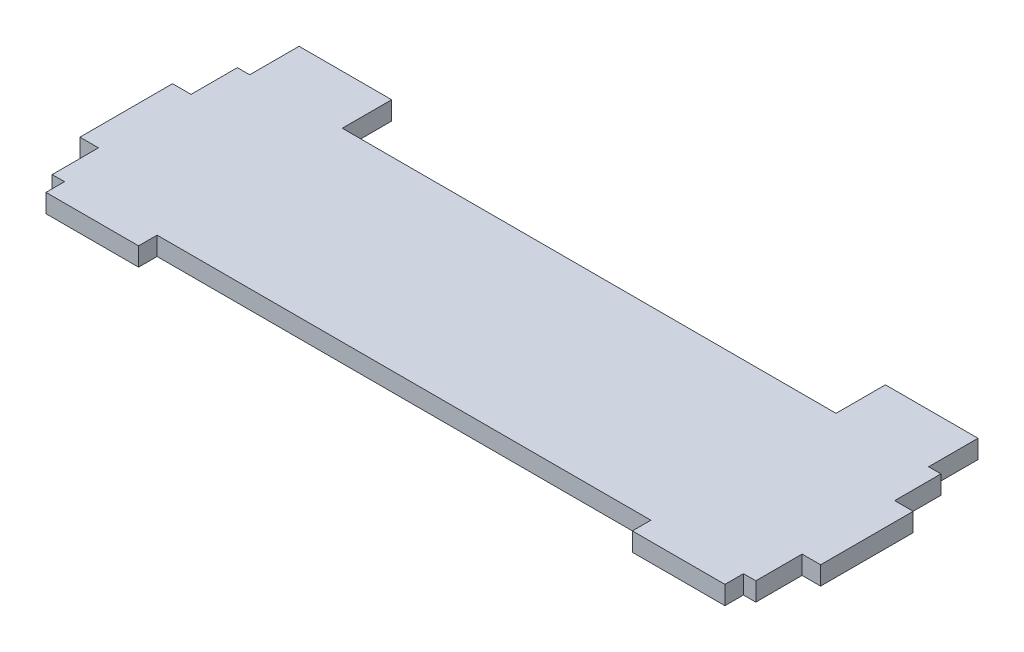
ISO-10303-21;
HEADER;
FILE_DESCRIPTION(('STEP AP214'),'2;1');
FILE_NAME('part.step','',(''),(''),'','','');
FILE_SCHEMA(('AUTOMOTIVE_DESIGN { 1 0 10303 214 1 1 1 1 }'));
ENDSEC;
DATA;
#1=APPLICATION_CONTEXT('core data for automotive mechanical design processes');
#2=APPLICATION_PROTOCOL_DEFINITION('international standard','automotive_design',2000,#1);
#3=PRODUCT_CONTEXT('',#1,'mechanical');
#4=PRODUCT('Part','Part','',(#3));
#5=PRODUCT_RELATED_PRODUCT_CATEGORY('part','',(#4));
#6=PRODUCT_DEFINITION_FORMATION('','',#4);
#7=PRODUCT_DEFINITION_CONTEXT('part definition',#1,'design');
#8=PRODUCT_DEFINITION('design','',#6,#7);
#9=PRODUCT_DEFINITION_SHAPE('','',#8);
#10=(LENGTH_UNIT() NAMED_UNIT(*) SI_UNIT(.MILLI.,.METRE.));
#11=(NAMED_UNIT(*) PLANE_ANGLE_UNIT() SI_UNIT($,.RADIAN.));
#12=(NAMED_UNIT(*) SI_UNIT($,.STERADIAN.) SOLID_ANGLE_UNIT());
#13=UNCERTAINTY_MEASURE_WITH_UNIT(LENGTH_MEASURE(1.E-05),#10,'distance_accuracy_value','');
#14=(GEOMETRIC_REPRESENTATION_CONTEXT(3) GLOBAL_UNCERTAINTY_ASSIGNED_CONTEXT((#13)) GLOBAL_UNIT_ASSIGNED_CONTEXT((#10,
#11,#12)) REPRESENTATION_CONTEXT('',''));
#15=CARTESIAN_POINT('',(0.,0.,0.));
#16=DIRECTION('',(0.,0.,1.));
#17=DIRECTION('',(1.,0.,0.));
#18=AXIS2_PLACEMENT_3D('',#15,#16,#17);
#19=CARTESIAN_POINT('',(57.,3.,-7.49999999999875));
#20=DIRECTION('',(0.,0.,1.));
#21=DIRECTION('',(1.,0.,0.));
#22=AXIS2_PLACEMENT_3D('',#19,#20,#21);
#23=PLANE('',#22);
#24=DIRECTION('',(-1.,0.,0.));
#25=VECTOR('',#24,1.);
#26=CARTESIAN_POINT('',(57.,0.,-7.49999999999875));
#27=LINE('',#26,#25);
#28=CARTESIAN_POINT('',(60.,0.,-7.49999999999875));
#29=VERTEX_POINT('',#28);
#30=CARTESIAN_POINT('',(57.,0.,-7.49999999999875));
#31=VERTEX_POINT('',#30);
#32=EDGE_CURVE('E248',#29,#31,#27,.T.);
#33=ORIENTED_EDGE('',*,*,#32,.T.);
#34=DIRECTION('',(0.,-1.,0.));
#35=VECTOR('',#34,1.);
#36=CARTESIAN_POINT('',(57.,3.,-7.49999999999875));
#37=LINE('',#36,#35);
#38=CARTESIAN_POINT('',(57.,3.,-7.49999999999875));
#39=VERTEX_POINT('',#38);
#40=EDGE_CURVE('E11',#39,#31,#37,.T.);
#41=ORIENTED_EDGE('',*,*,#40,.F.);
#42=DIRECTION('',(-1.,0.,0.));
#43=VECTOR('',#42,1.);
#44=CARTESIAN_POINT('',(57.,3.,-7.49999999999875));
#45=LINE('',#44,#43);
#46=CARTESIAN_POINT('',(60.,3.,-7.49999999999875));
#47=VERTEX_POINT('',#46);
#48=EDGE_CURVE('E302',#47,#39,#45,.T.);
#49=ORIENTED_EDGE('',*,*,#48,.F.);
#50=DIRECTION('',(0.,-1.,0.));
#51=VECTOR('',#50,1.);
#52=CARTESIAN_POINT('',(60.,3.,-7.49999999999875));
#53=LINE('',#52,#51);
#54=EDGE_CURVE('E244',#47,#29,#53,.T.);
#55=ORIENTED_EDGE('',*,*,#54,.T.);
#56=EDGE_LOOP('',(#33,#41,#49,#55));
#57=FACE_BOUND('',#56,.T.);
#58=ADVANCED_FACE('F32',(#57),#23,.F.);
#59=CARTESIAN_POINT('',(57.,3.,-15.));
#60=DIRECTION('',(-1.,0.,0.));
#61=DIRECTION('',(0.,0.,1.));
#62=AXIS2_PLACEMENT_3D('',#59,#60,#61);
#63=PLANE('',#62);
#64=DIRECTION('',(0.,0.,-1.));
#65=VECTOR('',#64,1.);
#66=CARTESIAN_POINT('',(57.,0.,-15.));
#67=LINE('',#66,#65);
#68=CARTESIAN_POINT('',(57.,0.,-15.));
#69=VERTEX_POINT('',#68);
#70=EDGE_CURVE('E251',#31,#69,#67,.T.);
#71=ORIENTED_EDGE('',*,*,#70,.T.);
#72=DIRECTION('',(0.,-1.,0.));
#73=VECTOR('',#72,1.);
#74=CARTESIAN_POINT('',(57.,3.,-15.));
#75=LINE('',#74,#73);
#76=CARTESIAN_POINT('',(57.,3.,-15.));
#77=VERTEX_POINT('',#76);
#78=EDGE_CURVE('E40',#77,#69,#75,.T.);
#79=ORIENTED_EDGE('',*,*,#78,.F.);
#80=DIRECTION('',(0.,0.,-1.));
#81=VECTOR('',#80,1.);
#82=CARTESIAN_POINT('',(57.,3.,-15.));
#83=LINE('',#82,#81);
#84=EDGE_CURVE('E151',#39,#77,#83,.T.);
#85=ORIENTED_EDGE('',*,*,#84,.F.);
#86=ORIENTED_EDGE('',*,*,#40,.T.);
#87=EDGE_LOOP('',(#71,#79,#85,#86));
#88=FACE_BOUND('',#87,.T.);
#89=ADVANCED_FACE('F460',(#88),#63,.F.);
#90=CARTESIAN_POINT('',(55.,3.,-15.));
#91=DIRECTION('',(0.,0.,1.));
#92=DIRECTION('',(1.,0.,0.));
#93=AXIS2_PLACEMENT_3D('',#90,#91,#92);
#94=PLANE('',#93);
#95=DIRECTION('',(-1.,0.,0.));
#96=VECTOR('',#95,1.);
#97=CARTESIAN_POINT('',(55.,0.,-15.));
#98=LINE('',#97,#96);
#99=CARTESIAN_POINT('',(55.,0.,-15.));
#100=VERTEX_POINT('',#99);
#101=EDGE_CURVE('E253',#69,#100,#98,.T.);
#102=ORIENTED_EDGE('',*,*,#101,.T.);
#103=DIRECTION('',(0.,-1.,0.));
#104=VECTOR('',#103,1.);
#105=CARTESIAN_POINT('',(55.,3.,-15.));
#106=LINE('',#105,#104);
#107=CARTESIAN_POINT('',(55.,3.,-15.));
#108=VERTEX_POINT('',#107);
#109=EDGE_CURVE('E369',#108,#100,#106,.T.);
#110=ORIENTED_EDGE('',*,*,#109,.F.);
#111=DIRECTION('',(-1.,0.,0.));
#112=VECTOR('',#111,1.);
#113=CARTESIAN_POINT('',(55.,3.,-15.));
#114=LINE('',#113,#112);
#115=EDGE_CURVE('E377',#77,#108,#114,.T.);
#116=ORIENTED_EDGE('',*,*,#115,.F.);
#117=ORIENTED_EDGE('',*,*,#78,.T.);
#118=EDGE_LOOP('',(#102,#110,#116,#117));
#119=FACE_BOUND('',#118,.T.);
#120=ADVANCED_FACE('F375',(#119),#94,.F.);
#121=CARTESIAN_POINT('',(55.,3.,-23.));
#122=DIRECTION('',(-1.,0.,0.));
#123=DIRECTION('',(0.,0.,1.));
#124=AXIS2_PLACEMENT_3D('',#121,#122,#123);
#125=PLANE('',#124);
#126=DIRECTION('',(0.,0.,-1.));
#127=VECTOR('',#126,1.);
#128=CARTESIAN_POINT('',(55.,0.,-23.));
#129=LINE('',#128,#127);
#130=CARTESIAN_POINT('',(55.,0.,-23.));
#131=VERTEX_POINT('',#130);
#132=EDGE_CURVE('E255',#100,#131,#129,.T.);
#133=ORIENTED_EDGE('',*,*,#132,.T.);
#134=DIRECTION('',(0.,-1.,0.));
#135=VECTOR('',#134,1.);
#136=CARTESIAN_POINT('',(55.,3.,-23.));
#137=LINE('',#136,#135);
#138=CARTESIAN_POINT('',(55.,3.,-23.));
#139=VERTEX_POINT('',#138);
#140=EDGE_CURVE('E366',#139,#131,#137,.T.);
#141=ORIENTED_EDGE('',*,*,#140,.F.);
#142=DIRECTION('',(0.,0.,-1.));
#143=VECTOR('',#142,1.);
#144=CARTESIAN_POINT('',(55.,3.,-23.));
#145=LINE('',#144,#143);
#146=EDGE_CURVE('E395',#108,#139,#145,.T.);
#147=ORIENTED_EDGE('',*,*,#146,.F.);
#148=ORIENTED_EDGE('',*,*,#109,.T.);
#149=EDGE_LOOP('',(#133,#141,#147,#148));
#150=FACE_BOUND('',#149,.T.);
#151=ADVANCED_FACE('F386',(#150),#125,.F.);
#152=CARTESIAN_POINT('',(40.,3.,-23.));
#153=DIRECTION('',(0.,0.,1.));
#154=DIRECTION('',(1.,0.,0.));
#155=AXIS2_PLACEMENT_3D('',#152,#153,#154);
#156=PLANE('',#155);
#157=DIRECTION('',(-1.,0.,0.));
#158=VECTOR('',#157,1.);
#159=CARTESIAN_POINT('',(40.,0.,-23.));
#160=LINE('',#159,#158);
#161=CARTESIAN_POINT('',(40.,0.,-23.));
#162=VERTEX_POINT('',#161);
#163=EDGE_CURVE('E257',#131,#162,#160,.T.);
#164=ORIENTED_EDGE('',*,*,#163,.T.);
#165=DIRECTION('',(0.,-1.,0.));
#166=VECTOR('',#165,1.);
#167=CARTESIAN_POINT('',(40.,3.,-23.));
#168=LINE('',#167,#166);
#169=CARTESIAN_POINT('',(40.,3.,-23.));
#170=VERTEX_POINT('',#169);
#171=EDGE_CURVE('E363',#170,#162,#168,.T.);
#172=ORIENTED_EDGE('',*,*,#171,.F.);
#173=DIRECTION('',(-1.,0.,0.));
#174=VECTOR('',#173,1.);
#175=CARTESIAN_POINT('',(40.,3.,-23.));
#176=LINE('',#175,#174);
#177=EDGE_CURVE('E392',#139,#170,#176,.T.);
#178=ORIENTED_EDGE('',*,*,#177,.F.);
#179=ORIENTED_EDGE('',*,*,#140,.T.);
#180=EDGE_LOOP('',(#164,#172,#178,#179));
#181=FACE_BOUND('',#180,.T.);
#182=ADVANCED_FACE('F390',(#181),#156,.F.);
#183=CARTESIAN_POINT('',(40.,3.,-15.));
#184=DIRECTION('',(1.,0.,0.));
#185=DIRECTION('',(0.,0.,-1.));
#186=AXIS2_PLACEMENT_3D('',#183,#184,#185);
#187=PLANE('',#186);
#188=DIRECTION('',(0.,0.,1.));
#189=VECTOR('',#188,1.);
#190=CARTESIAN_POINT('',(40.,0.,-15.));
#191=LINE('',#190,#189);
#192=CARTESIAN_POINT('',(40.,0.,-15.));
#193=VERTEX_POINT('',#192);
#194=EDGE_CURVE('E259',#162,#193,#191,.T.);
#195=ORIENTED_EDGE('',*,*,#194,.T.);
#196=DIRECTION('',(0.,-1.,0.));
#197=VECTOR('',#196,1.);
#198=CARTESIAN_POINT('',(40.,3.,-15.));
#199=LINE('',#198,#197);
#200=CARTESIAN_POINT('',(40.,3.,-15.));
#201=VERTEX_POINT('',#200);
#202=EDGE_CURVE('E360',#201,#193,#199,.T.);
#203=ORIENTED_EDGE('',*,*,#202,.F.);
#204=DIRECTION('',(0.,0.,1.));
#205=VECTOR('',#204,1.);
#206=CARTESIAN_POINT('',(40.,3.,-15.));
#207=LINE('',#206,#205);
#208=EDGE_CURVE('E394',#170,#201,#207,.T.);
#209=ORIENTED_EDGE('',*,*,#208,.F.);
#210=ORIENTED_EDGE('',*,*,#171,.T.);
#211=EDGE_LOOP('',(#195,#203,#209,#210));
#212=FACE_BOUND('',#211,.T.);
#213=ADVANCED_FACE('F473',(#212),#187,.F.);
#214=CARTESIAN_POINT('',(-40.,3.,-15.));
#215=DIRECTION('',(0.,0.,1.));
#216=DIRECTION('',(1.,0.,0.));
#217=AXIS2_PLACEMENT_3D('',#214,#215,#216);
#218=PLANE('',#217);
#219=DIRECTION('',(-1.,0.,0.));
#220=VECTOR('',#219,1.);
#221=CARTESIAN_POINT('',(-40.,0.,-15.));
#222=LINE('',#221,#220);
#223=CARTESIAN_POINT('',(-40.,0.,-15.));
#224=VERTEX_POINT('',#223);
#225=EDGE_CURVE('E261',#193,#224,#222,.T.);
#226=ORIENTED_EDGE('',*,*,#225,.T.);
#227=DIRECTION('',(0.,-1.,0.));
#228=VECTOR('',#227,1.);
#229=CARTESIAN_POINT('',(-40.,3.,-15.));
#230=LINE('',#229,#228);
#231=CARTESIAN_POINT('',(-40.,3.,-15.));
#232=VERTEX_POINT('',#231);
#233=EDGE_CURVE('E357',#232,#224,#230,.T.);
#234=ORIENTED_EDGE('',*,*,#233,.F.);
#235=DIRECTION('',(-1.,0.,0.));
#236=VECTOR('',#235,1.);
#237=CARTESIAN_POINT('',(-40.,3.,-15.));
#238=LINE('',#237,#236);
#239=EDGE_CURVE('E397',#201,#232,#238,.T.);
#240=ORIENTED_EDGE('',*,*,#239,.F.);
#241=ORIENTED_EDGE('',*,*,#202,.T.);
#242=EDGE_LOOP('',(#226,#234,#240,#241));
#243=FACE_BOUND('',#242,.T.);
#244=ADVANCED_FACE('F476',(#243),#218,.F.);
#245=CARTESIAN_POINT('',(-40.,3.,-23.));
#246=DIRECTION('',(-1.,0.,0.));
#247=DIRECTION('',(0.,0.,1.));
#248=AXIS2_PLACEMENT_3D('',#245,#246,#247);
#249=PLANE('',#248);
#250=DIRECTION('',(0.,0.,-1.));
#251=VECTOR('',#250,1.);
#252=CARTESIAN_POINT('',(-40.,0.,-23.));
#253=LINE('',#252,#251);
#254=CARTESIAN_POINT('',(-40.,0.,-23.));
#255=VERTEX_POINT('',#254);
#256=EDGE_CURVE('E263',#224,#255,#253,.T.);
#257=ORIENTED_EDGE('',*,*,#256,.T.);
#258=DIRECTION('',(0.,-1.,0.));
#259=VECTOR('',#258,1.);
#260=CARTESIAN_POINT('',(-40.,3.,-23.));
#261=LINE('',#260,#259);
#262=CARTESIAN_POINT('',(-40.,3.,-23.));
#263=VERTEX_POINT('',#262);
#264=EDGE_CURVE('E354',#263,#255,#261,.T.);
#265=ORIENTED_EDGE('',*,*,#264,.F.);
#266=DIRECTION('',(0.,0.,-1.));
#267=VECTOR('',#266,1.);
#268=CARTESIAN_POINT('',(-40.,3.,-23.));
#269=LINE('',#268,#267);
#270=EDGE_CURVE('E403',#232,#263,#269,.T.);
#271=ORIENTED_EDGE('',*,*,#270,.F.);
#272=ORIENTED_EDGE('',*,*,#233,.T.);
#273=EDGE_LOOP('',(#257,#265,#271,#272));
#274=FACE_BOUND('',#273,.T.);
#275=ADVANCED_FACE('F480',(#274),#249,.F.);
#276=CARTESIAN_POINT('',(-55.,3.,-23.));
#277=DIRECTION('',(0.,0.,1.));
#278=DIRECTION('',(1.,0.,0.));
#279=AXIS2_PLACEMENT_3D('',#276,#277,#278);
#280=PLANE('',#279);
#281=DIRECTION('',(-1.,0.,0.));
#282=VECTOR('',#281,1.);
#283=CARTESIAN_POINT('',(-55.,0.,-23.));
#284=LINE('',#283,#282);
#285=CARTESIAN_POINT('',(-55.,0.,-23.));
#286=VERTEX_POINT('',#285);
#287=EDGE_CURVE('E265',#255,#286,#284,.T.);
#288=ORIENTED_EDGE('',*,*,#287,.T.);
#289=DIRECTION('',(0.,-1.,0.));
#290=VECTOR('',#289,1.);
#291=CARTESIAN_POINT('',(-55.,3.,-23.));
#292=LINE('',#291,#290);
#293=CARTESIAN_POINT('',(-55.,3.,-23.));
#294=VERTEX_POINT('',#293);
#295=EDGE_CURVE('E351',#294,#286,#292,.T.);
#296=ORIENTED_EDGE('',*,*,#295,.F.);
#297=DIRECTION('',(-1.,0.,0.));
#298=VECTOR('',#297,1.);
#299=CARTESIAN_POINT('',(-55.,3.,-23.));
#300=LINE('',#299,#298);
#301=EDGE_CURVE('E405',#263,#294,#300,.T.);
#302=ORIENTED_EDGE('',*,*,#301,.F.);
#303=ORIENTED_EDGE('',*,*,#264,.T.);
#304=EDGE_LOOP('',(#288,#296,#302,#303));
#305=FACE_BOUND('',#304,.T.);
#306=ADVANCED_FACE('F484',(#305),#280,.F.);
#307=CARTESIAN_POINT('',(-55.,3.,-15.));
#308=DIRECTION('',(1.,0.,0.));
#309=DIRECTION('',(0.,0.,-1.));
#310=AXIS2_PLACEMENT_3D('',#307,#308,#309);
#311=PLANE('',#310);
#312=DIRECTION('',(0.,0.,1.));
#313=VECTOR('',#312,1.);
#314=CARTESIAN_POINT('',(-55.,0.,-15.));
#315=LINE('',#314,#313);
#316=CARTESIAN_POINT('',(-55.,0.,-15.));
#317=VERTEX_POINT('',#316);
#318=EDGE_CURVE('E267',#286,#317,#315,.T.);
#319=ORIENTED_EDGE('',*,*,#318,.T.);
#320=DIRECTION('',(0.,-1.,0.));
#321=VECTOR('',#320,1.);
#322=CARTESIAN_POINT('',(-55.,3.,-15.));
#323=LINE('',#322,#321);
#324=CARTESIAN_POINT('',(-55.,3.,-15.));
#325=VERTEX_POINT('',#324);
#326=EDGE_CURVE('E348',#325,#317,#323,.T.);
#327=ORIENTED_EDGE('',*,*,#326,.F.);
#328=DIRECTION('',(0.,0.,1.));
#329=VECTOR('',#328,1.);
#330=CARTESIAN_POINT('',(-55.,3.,-15.));
#331=LINE('',#330,#329);
#332=EDGE_CURVE('E407',#294,#325,#331,.T.);
#333=ORIENTED_EDGE('',*,*,#332,.F.);
#334=ORIENTED_EDGE('',*,*,#295,.T.);
#335=EDGE_LOOP('',(#319,#327,#333,#334));
#336=FACE_BOUND('',#335,.T.);
#337=ADVANCED_FACE('F488',(#336),#311,.F.);
#338=CARTESIAN_POINT('',(-57.,3.,-15.));
#339=DIRECTION('',(0.,0.,1.));
#340=DIRECTION('',(1.,0.,0.));
#341=AXIS2_PLACEMENT_3D('',#338,#339,#340);
#342=PLANE('',#341);
#343=DIRECTION('',(-1.,0.,0.));
#344=VECTOR('',#343,1.);
#345=CARTESIAN_POINT('',(-57.,0.,-15.));
#346=LINE('',#345,#344);
#347=CARTESIAN_POINT('',(-57.,0.,-15.));
#348=VERTEX_POINT('',#347);
#349=EDGE_CURVE('E269',#317,#348,#346,.T.);
#350=ORIENTED_EDGE('',*,*,#349,.T.);
#351=DIRECTION('',(0.,-1.,0.));
#352=VECTOR('',#351,1.);
#353=CARTESIAN_POINT('',(-57.,3.,-15.));
#354=LINE('',#353,#352);
#355=CARTESIAN_POINT('',(-57.,3.,-15.));
#356=VERTEX_POINT('',#355);
#357=EDGE_CURVE('E345',#356,#348,#354,.T.);
#358=ORIENTED_EDGE('',*,*,#357,.F.);
#359=DIRECTION('',(-1.,0.,0.));
#360=VECTOR('',#359,1.);
#361=CARTESIAN_POINT('',(-57.,3.,-15.));
#362=LINE('',#361,#360);
#363=EDGE_CURVE('E409',#325,#356,#362,.T.);
#364=ORIENTED_EDGE('',*,*,#363,.F.);
#365=ORIENTED_EDGE('',*,*,#326,.T.);
#366=EDGE_LOOP('',(#350,#358,#364,#365));
#367=FACE_BOUND('',#366,.T.);
#368=ADVANCED_FACE('F492',(#367),#342,.F.);
#369=CARTESIAN_POINT('',(-57.,3.,-7.5));
#370=DIRECTION('',(1.,0.,0.));
#371=DIRECTION('',(0.,0.,-1.));
#372=AXIS2_PLACEMENT_3D('',#369,#370,#371);
#373=PLANE('',#372);
#374=DIRECTION('',(0.,0.,1.));
#375=VECTOR('',#374,1.);
#376=CARTESIAN_POINT('',(-57.,0.,-7.5));
#377=LINE('',#376,#375);
#378=CARTESIAN_POINT('',(-57.,0.,-7.5));
#379=VERTEX_POINT('',#378);
#380=EDGE_CURVE('E271',#348,#379,#377,.T.);
#381=ORIENTED_EDGE('',*,*,#380,.T.);
#382=DIRECTION('',(0.,-1.,0.));
#383=VECTOR('',#382,1.);
#384=CARTESIAN_POINT('',(-57.,3.,-7.5));
#385=LINE('',#384,#383);
#386=CARTESIAN_POINT('',(-57.,3.,-7.5));
#387=VERTEX_POINT('',#386);
#388=EDGE_CURVE('E342',#387,#379,#385,.T.);
#389=ORIENTED_EDGE('',*,*,#388,.F.);
#390=DIRECTION('',(0.,0.,1.));
#391=VECTOR('',#390,1.);
#392=CARTESIAN_POINT('',(-57.,3.,-7.5));
#393=LINE('',#392,#391);
#394=EDGE_CURVE('E411',#356,#387,#393,.T.);
#395=ORIENTED_EDGE('',*,*,#394,.F.);
#396=ORIENTED_EDGE('',*,*,#357,.T.);
#397=EDGE_LOOP('',(#381,#389,#395,#396));
#398=FACE_BOUND('',#397,.T.);
#399=ADVANCED_FACE('F496',(#398),#373,.F.);
#400=CARTESIAN_POINT('',(-60.,3.,-7.5));
#401=DIRECTION('',(0.,0.,1.));
#402=DIRECTION('',(1.,0.,0.));
#403=AXIS2_PLACEMENT_3D('',#400,#401,#402);
#404=PLANE('',#403);
#405=DIRECTION('',(-1.,0.,0.));
#406=VECTOR('',#405,1.);
#407=CARTESIAN_POINT('',(-60.,0.,-7.5));
#408=LINE('',#407,#406);
#409=CARTESIAN_POINT('',(-60.,0.,-7.5));
#410=VERTEX_POINT('',#409);
#411=EDGE_CURVE('E273',#379,#410,#408,.T.);
#412=ORIENTED_EDGE('',*,*,#411,.T.);
#413=DIRECTION('',(0.,-1.,0.));
#414=VECTOR('',#413,1.);
#415=CARTESIAN_POINT('',(-60.,3.,-7.5));
#416=LINE('',#415,#414);
#417=CARTESIAN_POINT('',(-60.,3.,-7.5));
#418=VERTEX_POINT('',#417);
#419=EDGE_CURVE('E339',#418,#410,#416,.T.);
#420=ORIENTED_EDGE('',*,*,#419,.F.);
#421=DIRECTION('',(-1.,0.,0.));
#422=VECTOR('',#421,1.);
#423=CARTESIAN_POINT('',(-60.,3.,-7.5));
#424=LINE('',#423,#422);
#425=EDGE_CURVE('E413',#387,#418,#424,.T.);
#426=ORIENTED_EDGE('',*,*,#425,.F.);
#427=ORIENTED_EDGE('',*,*,#388,.T.);
#428=EDGE_LOOP('',(#412,#420,#426,#427));
#429=FACE_BOUND('',#428,.T.);
#430=ADVANCED_FACE('F500',(#429),#404,.F.);
#431=CARTESIAN_POINT('',(-60.,3.,7.5));
#432=DIRECTION('',(1.,0.,0.));
#433=DIRECTION('',(0.,0.,-1.));
#434=AXIS2_PLACEMENT_3D('',#431,#432,#433);
#435=PLANE('',#434);
#436=DIRECTION('',(0.,0.,1.));
#437=VECTOR('',#436,1.);
#438=CARTESIAN_POINT('',(-60.,0.,7.5));
#439=LINE('',#438,#437);
#440=CARTESIAN_POINT('',(-60.,0.,7.5));
#441=VERTEX_POINT('',#440);
#442=EDGE_CURVE('E275',#410,#441,#439,.T.);
#443=ORIENTED_EDGE('',*,*,#442,.T.);
#444=DIRECTION('',(0.,-1.,0.));
#445=VECTOR('',#444,1.);
#446=CARTESIAN_POINT('',(-60.,3.,7.5));
#447=LINE('',#446,#445);
#448=CARTESIAN_POINT('',(-60.,3.,7.5));
#449=VERTEX_POINT('',#448);
#450=EDGE_CURVE('E336',#449,#441,#447,.T.);
#451=ORIENTED_EDGE('',*,*,#450,.F.);
#452=DIRECTION('',(0.,0.,1.));
#453=VECTOR('',#452,1.);
#454=CARTESIAN_POINT('',(-60.,3.,7.5));
#455=LINE('',#454,#453);
#456=EDGE_CURVE('E415',#418,#449,#455,.T.);
#457=ORIENTED_EDGE('',*,*,#456,.F.);
#458=ORIENTED_EDGE('',*,*,#419,.T.);
#459=EDGE_LOOP('',(#443,#451,#457,#458));
#460=FACE_BOUND('',#459,.T.);
#461=ADVANCED_FACE('F504',(#460),#435,.F.);
#462=CARTESIAN_POINT('',(-57.,3.,7.5));
#463=DIRECTION('',(0.,0.,-1.));
#464=DIRECTION('',(-1.,0.,0.));
#465=AXIS2_PLACEMENT_3D('',#462,#463,#464);
#466=PLANE('',#465);
#467=DIRECTION('',(1.,0.,0.));
#468=VECTOR('',#467,1.);
#469=CARTESIAN_POINT('',(-57.,0.,7.5));
#470=LINE('',#469,#468);
#471=CARTESIAN_POINT('',(-57.,0.,7.5));
#472=VERTEX_POINT('',#471);
#473=EDGE_CURVE('E277',#441,#472,#470,.T.);
#474=ORIENTED_EDGE('',*,*,#473,.T.);
#475=DIRECTION('',(0.,-1.,0.));
#476=VECTOR('',#475,1.);
#477=CARTESIAN_POINT('',(-57.,3.,7.5));
#478=LINE('',#477,#476);
#479=CARTESIAN_POINT('',(-57.,3.,7.5));
#480=VERTEX_POINT('',#479);
#481=EDGE_CURVE('E333',#480,#472,#478,.T.);
#482=ORIENTED_EDGE('',*,*,#481,.F.);
#483=DIRECTION('',(1.,0.,0.));
#484=VECTOR('',#483,1.);
#485=CARTESIAN_POINT('',(-57.,3.,7.5));
#486=LINE('',#485,#484);
#487=EDGE_CURVE('E417',#449,#480,#486,.T.);
#488=ORIENTED_EDGE('',*,*,#487,.F.);
#489=ORIENTED_EDGE('',*,*,#450,.T.);
#490=EDGE_LOOP('',(#474,#482,#488,#489));
#491=FACE_BOUND('',#490,.T.);
#492=ADVANCED_FACE('F508',(#491),#466,.F.);
#493=CARTESIAN_POINT('',(-57.,3.,15.));
#494=DIRECTION('',(1.,0.,0.));
#495=DIRECTION('',(0.,0.,-1.));
#496=AXIS2_PLACEMENT_3D('',#493,#494,#495);
#497=PLANE('',#496);
#498=DIRECTION('',(0.,0.,1.));
#499=VECTOR('',#498,1.);
#500=CARTESIAN_POINT('',(-57.,0.,15.));
#501=LINE('',#500,#499);
#502=CARTESIAN_POINT('',(-57.,0.,15.));
#503=VERTEX_POINT('',#502);
#504=EDGE_CURVE('E279',#472,#503,#501,.T.);
#505=ORIENTED_EDGE('',*,*,#504,.T.);
#506=DIRECTION('',(0.,-1.,0.));
#507=VECTOR('',#506,1.);
#508=CARTESIAN_POINT('',(-57.,3.,15.));
#509=LINE('',#508,#507);
#510=CARTESIAN_POINT('',(-57.,3.,15.));
#511=VERTEX_POINT('',#510);
#512=EDGE_CURVE('E330',#511,#503,#509,.T.);
#513=ORIENTED_EDGE('',*,*,#512,.F.);
#514=DIRECTION('',(0.,0.,1.));
#515=VECTOR('',#514,1.);
#516=CARTESIAN_POINT('',(-57.,3.,15.));
#517=LINE('',#516,#515);
#518=EDGE_CURVE('E419',#480,#511,#517,.T.);
#519=ORIENTED_EDGE('',*,*,#518,.F.);
#520=ORIENTED_EDGE('',*,*,#481,.T.);
#521=EDGE_LOOP('',(#505,#513,#519,#520));
#522=FACE_BOUND('',#521,.T.);
#523=ADVANCED_FACE('F512',(#522),#497,.F.);
#524=CARTESIAN_POINT('',(-57.,3.,15.));
#525=DIRECTION('',(0.,0.,-1.));
#526=DIRECTION('',(-1.,0.,0.));
#527=AXIS2_PLACEMENT_3D('',#524,#525,#526);
#528=PLANE('',#527);
#529=DIRECTION('',(1.,0.,0.));
#530=VECTOR('',#529,1.);
#531=CARTESIAN_POINT('',(-57.,0.,15.));
#532=LINE('',#531,#530);
#533=CARTESIAN_POINT('',(-55.,0.,15.));
#534=VERTEX_POINT('',#533);
#535=EDGE_CURVE('E281',#503,#534,#532,.T.);
#536=ORIENTED_EDGE('',*,*,#535,.T.);
#537=DIRECTION('',(0.,-1.,0.));
#538=VECTOR('',#537,1.);
#539=CARTESIAN_POINT('',(-55.,3.,15.));
#540=LINE('',#539,#538);
#541=CARTESIAN_POINT('',(-55.,3.,15.));
#542=VERTEX_POINT('',#541);
#543=EDGE_CURVE('E327',#542,#534,#540,.T.);
#544=ORIENTED_EDGE('',*,*,#543,.F.);
#545=DIRECTION('',(1.,0.,0.));
#546=VECTOR('',#545,1.);
#547=CARTESIAN_POINT('',(-57.,3.,15.));
#548=LINE('',#547,#546);
#549=EDGE_CURVE('E421',#511,#542,#548,.T.);
#550=ORIENTED_EDGE('',*,*,#549,.F.);
#551=ORIENTED_EDGE('',*,*,#512,.T.);
#552=EDGE_LOOP('',(#536,#544,#550,#551));
#553=FACE_BOUND('',#552,.T.);
#554=ADVANCED_FACE('F516',(#553),#528,.F.);
#555=CARTESIAN_POINT('',(-55.,3.,15.));
#556=DIRECTION('',(1.,0.,0.));
#557=DIRECTION('',(0.,0.,-1.));
#558=AXIS2_PLACEMENT_3D('',#555,#556,#557);
#559=PLANE('',#558);
#560=DIRECTION('',(0.,0.,1.));
#561=VECTOR('',#560,1.);
#562=CARTESIAN_POINT('',(-55.,0.,15.));
#563=LINE('',#562,#561);
#564=CARTESIAN_POINT('',(-55.,0.,18.));
#565=VERTEX_POINT('',#564);
#566=EDGE_CURVE('E283',#534,#565,#563,.T.);
#567=ORIENTED_EDGE('',*,*,#566,.T.);
#568=DIRECTION('',(0.,-1.,0.));
#569=VECTOR('',#568,1.);
#570=CARTESIAN_POINT('',(-55.,3.,18.));
#571=LINE('',#570,#569);
#572=CARTESIAN_POINT('',(-55.,3.,18.));
#573=VERTEX_POINT('',#572);
#574=EDGE_CURVE('E324',#573,#565,#571,.T.);
#575=ORIENTED_EDGE('',*,*,#574,.F.);
#576=DIRECTION('',(0.,0.,1.));
#577=VECTOR('',#576,1.);
#578=CARTESIAN_POINT('',(-55.,3.,15.));
#579=LINE('',#578,#577);
#580=EDGE_CURVE('E423',#542,#573,#579,.T.);
#581=ORIENTED_EDGE('',*,*,#580,.F.);
#582=ORIENTED_EDGE('',*,*,#543,.T.);
#583=EDGE_LOOP('',(#567,#575,#581,#582));
#584=FACE_BOUND('',#583,.T.);
#585=ADVANCED_FACE('F520',(#584),#559,.F.);
#586=CARTESIAN_POINT('',(-55.,3.,18.));
#587=DIRECTION('',(0.,0.,-1.));
#588=DIRECTION('',(-1.,0.,0.));
#589=AXIS2_PLACEMENT_3D('',#586,#587,#588);
#590=PLANE('',#589);
#591=DIRECTION('',(1.,0.,0.));
#592=VECTOR('',#591,1.);
#593=CARTESIAN_POINT('',(-55.,0.,18.));
#594=LINE('',#593,#592);
#595=CARTESIAN_POINT('',(-40.,0.,18.));
#596=VERTEX_POINT('',#595);
#597=EDGE_CURVE('E285',#565,#596,#594,.T.);
#598=ORIENTED_EDGE('',*,*,#597,.T.);
#599=DIRECTION('',(0.,-1.,0.));
#600=VECTOR('',#599,1.);
#601=CARTESIAN_POINT('',(-40.,3.,18.));
#602=LINE('',#601,#600);
#603=CARTESIAN_POINT('',(-40.,3.,18.));
#604=VERTEX_POINT('',#603);
#605=EDGE_CURVE('E321',#604,#596,#602,.T.);
#606=ORIENTED_EDGE('',*,*,#605,.F.);
#607=DIRECTION('',(1.,0.,0.));
#608=VECTOR('',#607,1.);
#609=CARTESIAN_POINT('',(-55.,3.,18.));
#610=LINE('',#609,#608);
#611=EDGE_CURVE('E425',#573,#604,#610,.T.);
#612=ORIENTED_EDGE('',*,*,#611,.F.);
#613=ORIENTED_EDGE('',*,*,#574,.T.);
#614=EDGE_LOOP('',(#598,#606,#612,#613));
#615=FACE_BOUND('',#614,.T.);
#616=ADVANCED_FACE('F524',(#615),#590,.F.);
#617=CARTESIAN_POINT('',(-40.,3.,18.));
#618=DIRECTION('',(-1.,0.,0.));
#619=DIRECTION('',(0.,0.,1.));
#620=AXIS2_PLACEMENT_3D('',#617,#618,#619);
#621=PLANE('',#620);
#622=DIRECTION('',(0.,0.,-1.));
#623=VECTOR('',#622,1.);
#624=CARTESIAN_POINT('',(-40.,0.,18.));
#625=LINE('',#624,#623);
#626=CARTESIAN_POINT('',(-40.,0.,15.));
#627=VERTEX_POINT('',#626);
#628=EDGE_CURVE('E287',#596,#627,#625,.T.);
#629=ORIENTED_EDGE('',*,*,#628,.T.);
#630=DIRECTION('',(0.,-1.,0.));
#631=VECTOR('',#630,1.);
#632=CARTESIAN_POINT('',(-40.,3.,15.));
#633=LINE('',#632,#631);
#634=CARTESIAN_POINT('',(-40.,3.,15.));
#635=VERTEX_POINT('',#634);
#636=EDGE_CURVE('E318',#635,#627,#633,.T.);
#637=ORIENTED_EDGE('',*,*,#636,.F.);
#638=DIRECTION('',(0.,0.,-1.));
#639=VECTOR('',#638,1.);
#640=CARTESIAN_POINT('',(-40.,3.,18.));
#641=LINE('',#640,#639);
#642=EDGE_CURVE('E427',#604,#635,#641,.T.);
#643=ORIENTED_EDGE('',*,*,#642,.F.);
#644=ORIENTED_EDGE('',*,*,#605,.T.);
#645=EDGE_LOOP('',(#629,#637,#643,#644));
#646=FACE_BOUND('',#645,.T.);
#647=ADVANCED_FACE('F528',(#646),#621,.F.);
#648=CARTESIAN_POINT('',(-40.,3.,15.));
#649=DIRECTION('',(0.,0.,-1.));
#650=DIRECTION('',(-1.,0.,0.));
#651=AXIS2_PLACEMENT_3D('',#648,#649,#650);
#652=PLANE('',#651);
#653=DIRECTION('',(1.,0.,0.));
#654=VECTOR('',#653,1.);
#655=CARTESIAN_POINT('',(-40.,0.,15.));
#656=LINE('',#655,#654);
#657=CARTESIAN_POINT('',(40.,0.,15.));
#658=VERTEX_POINT('',#657);
#659=EDGE_CURVE('E289',#627,#658,#656,.T.);
#660=ORIENTED_EDGE('',*,*,#659,.T.);
#661=DIRECTION('',(0.,-1.,0.));
#662=VECTOR('',#661,1.);
#663=CARTESIAN_POINT('',(40.,3.,15.));
#664=LINE('',#663,#662);
#665=CARTESIAN_POINT('',(40.,3.,15.));
#666=VERTEX_POINT('',#665);
#667=EDGE_CURVE('E315',#666,#658,#664,.T.);
#668=ORIENTED_EDGE('',*,*,#667,.F.);
#669=DIRECTION('',(1.,0.,0.));
#670=VECTOR('',#669,1.);
#671=CARTESIAN_POINT('',(-40.,3.,15.));
#672=LINE('',#671,#670);
#673=EDGE_CURVE('E429',#635,#666,#672,.T.);
#674=ORIENTED_EDGE('',*,*,#673,.F.);
#675=ORIENTED_EDGE('',*,*,#636,.T.);
#676=EDGE_LOOP('',(#660,#668,#674,#675));
#677=FACE_BOUND('',#676,.T.);
#678=ADVANCED_FACE('F532',(#677),#652,.F.);
#679=CARTESIAN_POINT('',(40.,3.,15.));
#680=DIRECTION('',(1.,0.,0.));
#681=DIRECTION('',(0.,0.,-1.));
#682=AXIS2_PLACEMENT_3D('',#679,#680,#681);
#683=PLANE('',#682);
#684=DIRECTION('',(0.,0.,1.));
#685=VECTOR('',#684,1.);
#686=CARTESIAN_POINT('',(40.,0.,15.));
#687=LINE('',#686,#685);
#688=CARTESIAN_POINT('',(40.,0.,18.));
#689=VERTEX_POINT('',#688);
#690=EDGE_CURVE('E291',#658,#689,#687,.T.);
#691=ORIENTED_EDGE('',*,*,#690,.T.);
#692=DIRECTION('',(0.,-1.,0.));
#693=VECTOR('',#692,1.);
#694=CARTESIAN_POINT('',(40.,3.,18.));
#695=LINE('',#694,#693);
#696=CARTESIAN_POINT('',(40.,3.,18.));
#697=VERTEX_POINT('',#696);
#698=EDGE_CURVE('E312',#697,#689,#695,.T.);
#699=ORIENTED_EDGE('',*,*,#698,.F.);
#700=DIRECTION('',(0.,0.,1.));
#701=VECTOR('',#700,1.);
#702=CARTESIAN_POINT('',(40.,3.,15.));
#703=LINE('',#702,#701);
#704=EDGE_CURVE('E431',#666,#697,#703,.T.);
#705=ORIENTED_EDGE('',*,*,#704,.F.);
#706=ORIENTED_EDGE('',*,*,#667,.T.);
#707=EDGE_LOOP('',(#691,#699,#705,#706));
#708=FACE_BOUND('',#707,.T.);
#709=ADVANCED_FACE('F536',(#708),#683,.F.);
#710=CARTESIAN_POINT('',(40.,3.,18.));
#711=DIRECTION('',(0.,0.,-1.));
#712=DIRECTION('',(-1.,0.,0.));
#713=AXIS2_PLACEMENT_3D('',#710,#711,#712);
#714=PLANE('',#713);
#715=DIRECTION('',(1.,0.,0.));
#716=VECTOR('',#715,1.);
#717=CARTESIAN_POINT('',(40.,0.,18.));
#718=LINE('',#717,#716);
#719=CARTESIAN_POINT('',(55.,0.,18.));
#720=VERTEX_POINT('',#719);
#721=EDGE_CURVE('E293',#689,#720,#718,.T.);
#722=ORIENTED_EDGE('',*,*,#721,.T.);
#723=DIRECTION('',(0.,-1.,0.));
#724=VECTOR('',#723,1.);
#725=CARTESIAN_POINT('',(55.,3.,18.));
#726=LINE('',#725,#724);
#727=CARTESIAN_POINT('',(55.,3.,18.));
#728=VERTEX_POINT('',#727);
#729=EDGE_CURVE('E309',#728,#720,#726,.T.);
#730=ORIENTED_EDGE('',*,*,#729,.F.);
#731=DIRECTION('',(1.,0.,0.));
#732=VECTOR('',#731,1.);
#733=CARTESIAN_POINT('',(40.,3.,18.));
#734=LINE('',#733,#732);
#735=EDGE_CURVE('E433',#697,#728,#734,.T.);
#736=ORIENTED_EDGE('',*,*,#735,.F.);
#737=ORIENTED_EDGE('',*,*,#698,.T.);
#738=EDGE_LOOP('',(#722,#730,#736,#737));
#739=FACE_BOUND('',#738,.T.);
#740=ADVANCED_FACE('F540',(#739),#714,.F.);
#741=CARTESIAN_POINT('',(55.,3.,18.));
#742=DIRECTION('',(-1.,0.,0.));
#743=DIRECTION('',(0.,0.,1.));
#744=AXIS2_PLACEMENT_3D('',#741,#742,#743);
#745=PLANE('',#744);
#746=DIRECTION('',(0.,0.,-1.));
#747=VECTOR('',#746,1.);
#748=CARTESIAN_POINT('',(55.,0.,18.));
#749=LINE('',#748,#747);
#750=CARTESIAN_POINT('',(55.,0.,15.));
#751=VERTEX_POINT('',#750);
#752=EDGE_CURVE('E295',#720,#751,#749,.T.);
#753=ORIENTED_EDGE('',*,*,#752,.T.);
#754=DIRECTION('',(0.,-1.,0.));
#755=VECTOR('',#754,1.);
#756=CARTESIAN_POINT('',(55.,3.,15.));
#757=LINE('',#756,#755);
#758=CARTESIAN_POINT('',(55.,3.,15.));
#759=VERTEX_POINT('',#758);
#760=EDGE_CURVE('E306',#759,#751,#757,.T.);
#761=ORIENTED_EDGE('',*,*,#760,.F.);
#762=DIRECTION('',(0.,0.,-1.));
#763=VECTOR('',#762,1.);
#764=CARTESIAN_POINT('',(55.,3.,18.));
#765=LINE('',#764,#763);
#766=EDGE_CURVE('E435',#728,#759,#765,.T.);
#767=ORIENTED_EDGE('',*,*,#766,.F.);
#768=ORIENTED_EDGE('',*,*,#729,.T.);
#769=EDGE_LOOP('',(#753,#761,#767,#768));
#770=FACE_BOUND('',#769,.T.);
#771=ADVANCED_FACE('F441',(#770),#745,.F.);
#772=CARTESIAN_POINT('',(55.,3.,15.));
#773=DIRECTION('',(0.,0.,-1.));
#774=DIRECTION('',(-1.,0.,0.));
#775=AXIS2_PLACEMENT_3D('',#772,#773,#774);
#776=PLANE('',#775);
#777=DIRECTION('',(1.,0.,0.));
#778=VECTOR('',#777,1.);
#779=CARTESIAN_POINT('',(55.,0.,15.));
#780=LINE('',#779,#778);
#781=CARTESIAN_POINT('',(57.,0.,15.));
#782=VERTEX_POINT('',#781);
#783=EDGE_CURVE('E297',#751,#782,#780,.T.);
#784=ORIENTED_EDGE('',*,*,#783,.T.);
#785=DIRECTION('',(0.,-1.,0.));
#786=VECTOR('',#785,1.);
#787=CARTESIAN_POINT('',(57.,3.,15.));
#788=LINE('',#787,#786);
#789=CARTESIAN_POINT('',(57.,3.,15.));
#790=VERTEX_POINT('',#789);
#791=EDGE_CURVE('E239',#790,#782,#788,.T.);
#792=ORIENTED_EDGE('',*,*,#791,.F.);
#793=DIRECTION('',(1.,0.,0.));
#794=VECTOR('',#793,1.);
#795=CARTESIAN_POINT('',(55.,3.,15.));
#796=LINE('',#795,#794);
#797=EDGE_CURVE('E230',#759,#790,#796,.T.);
#798=ORIENTED_EDGE('',*,*,#797,.F.);
#799=ORIENTED_EDGE('',*,*,#760,.T.);
#800=EDGE_LOOP('',(#784,#792,#798,#799));
#801=FACE_BOUND('',#800,.T.);
#802=ADVANCED_FACE('F445',(#801),#776,.F.);
#803=CARTESIAN_POINT('',(57.,3.,7.49999999999976));
#804=DIRECTION('',(-1.,0.,0.));
#805=DIRECTION('',(0.,0.,1.));
#806=AXIS2_PLACEMENT_3D('',#803,#804,#805);
#807=PLANE('',#806);
#808=DIRECTION('',(0.,0.,-1.));
#809=VECTOR('',#808,1.);
#810=CARTESIAN_POINT('',(57.,0.,7.49999999999976));
#811=LINE('',#810,#809);
#812=CARTESIAN_POINT('',(57.,0.,7.49999999999976));
#813=VERTEX_POINT('',#812);
#814=EDGE_CURVE('E238',#782,#813,#811,.T.);
#815=ORIENTED_EDGE('',*,*,#814,.T.);
#816=DIRECTION('',(0.,-1.,0.));
#817=VECTOR('',#816,1.);
#818=CARTESIAN_POINT('',(57.,3.,7.49999999999976));
#819=LINE('',#818,#817);
#820=CARTESIAN_POINT('',(57.,3.,7.49999999999976));
#821=VERTEX_POINT('',#820);
#822=EDGE_CURVE('E235',#821,#813,#819,.T.);
#823=ORIENTED_EDGE('',*,*,#822,.F.);
#824=DIRECTION('',(0.,0.,-1.));
#825=VECTOR('',#824,1.);
#826=CARTESIAN_POINT('',(57.,3.,7.49999999999976));
#827=LINE('',#826,#825);
#828=EDGE_CURVE('E224',#790,#821,#827,.T.);
#829=ORIENTED_EDGE('',*,*,#828,.F.);
#830=ORIENTED_EDGE('',*,*,#791,.T.);
#831=EDGE_LOOP('',(#815,#823,#829,#830));
#832=FACE_BOUND('',#831,.T.);
#833=ADVANCED_FACE('F236',(#832),#807,.F.);
#834=CARTESIAN_POINT('',(60.,3.,7.49999999999976));
#835=DIRECTION('',(0.,0.,-1.));
#836=DIRECTION('',(-1.,0.,0.));
#837=AXIS2_PLACEMENT_3D('',#834,#835,#836);
#838=PLANE('',#837);
#839=DIRECTION('',(1.,0.,0.));
#840=VECTOR('',#839,1.);
#841=CARTESIAN_POINT('',(60.,0.,7.49999999999976));
#842=LINE('',#841,#840);
#843=CARTESIAN_POINT('',(60.,0.,7.49999999999976));
#844=VERTEX_POINT('',#843);
#845=EDGE_CURVE('E137',#813,#844,#842,.T.);
#846=ORIENTED_EDGE('',*,*,#845,.T.);
#847=DIRECTION('',(0.,-1.,0.));
#848=VECTOR('',#847,1.);
#849=CARTESIAN_POINT('',(60.,3.,7.49999999999976));
#850=LINE('',#849,#848);
#851=CARTESIAN_POINT('',(60.,3.,7.49999999999976));
#852=VERTEX_POINT('',#851);
#853=EDGE_CURVE('E240',#852,#844,#850,.T.);
#854=ORIENTED_EDGE('',*,*,#853,.F.);
#855=DIRECTION('',(1.,0.,0.));
#856=VECTOR('',#855,1.);
#857=CARTESIAN_POINT('',(60.,3.,7.49999999999976));
#858=LINE('',#857,#856);
#859=EDGE_CURVE('E228',#821,#852,#858,.T.);
#860=ORIENTED_EDGE('',*,*,#859,.F.);
#861=ORIENTED_EDGE('',*,*,#822,.T.);
#862=EDGE_LOOP('',(#846,#854,#860,#861));
#863=FACE_BOUND('',#862,.T.);
#864=ADVANCED_FACE('F242',(#863),#838,.F.);
#865=CARTESIAN_POINT('',(60.,3.,-7.49999999999875));
#866=DIRECTION('',(-1.,0.,0.));
#867=DIRECTION('',(0.,0.,1.));
#868=AXIS2_PLACEMENT_3D('',#865,#866,#867);
#869=PLANE('',#868);
#870=DIRECTION('',(0.,0.,-1.));
#871=VECTOR('',#870,1.);
#872=CARTESIAN_POINT('',(60.,0.,-7.49999999999875));
#873=LINE('',#872,#871);
#874=EDGE_CURVE('E143',#844,#29,#873,.T.);
#875=ORIENTED_EDGE('',*,*,#874,.T.);
#876=ORIENTED_EDGE('',*,*,#54,.F.);
#877=DIRECTION('',(0.,0.,-1.));
#878=VECTOR('',#877,1.);
#879=CARTESIAN_POINT('',(60.,3.,-7.49999999999875));
#880=LINE('',#879,#878);
#881=EDGE_CURVE('E48',#852,#47,#880,.T.);
#882=ORIENTED_EDGE('',*,*,#881,.F.);
#883=ORIENTED_EDGE('',*,*,#853,.T.);
#884=EDGE_LOOP('',(#875,#876,#882,#883));
#885=FACE_BOUND('',#884,.T.);
#886=ADVANCED_FACE('F449',(#885),#869,.F.);
#887=CARTESIAN_POINT('',(0.,3.,0.));
#888=DIRECTION('',(0.,-1.,0.));
#889=DIRECTION('',(0.,0.,-1.));
#890=AXIS2_PLACEMENT_3D('',#887,#888,#889);
#891=PLANE('',#890);
#892=ORIENTED_EDGE('',*,*,#48,.T.);
#893=ORIENTED_EDGE('',*,*,#84,.T.);
#894=ORIENTED_EDGE('',*,*,#115,.T.);
#895=ORIENTED_EDGE('',*,*,#146,.T.);
#896=ORIENTED_EDGE('',*,*,#177,.T.);
#897=ORIENTED_EDGE('',*,*,#208,.T.);
#898=ORIENTED_EDGE('',*,*,#239,.T.);
#899=ORIENTED_EDGE('',*,*,#270,.T.);
#900=ORIENTED_EDGE('',*,*,#301,.T.);
#901=ORIENTED_EDGE('',*,*,#332,.T.);
#902=ORIENTED_EDGE('',*,*,#363,.T.);
#903=ORIENTED_EDGE('',*,*,#394,.T.);
#904=ORIENTED_EDGE('',*,*,#425,.T.);
#905=ORIENTED_EDGE('',*,*,#456,.T.);
#906=ORIENTED_EDGE('',*,*,#487,.T.);
#907=ORIENTED_EDGE('',*,*,#518,.T.);
#908=ORIENTED_EDGE('',*,*,#549,.T.);
#909=ORIENTED_EDGE('',*,*,#580,.T.);
#910=ORIENTED_EDGE('',*,*,#611,.T.);
#911=ORIENTED_EDGE('',*,*,#642,.T.);
#912=ORIENTED_EDGE('',*,*,#673,.T.);
#913=ORIENTED_EDGE('',*,*,#704,.T.);
#914=ORIENTED_EDGE('',*,*,#735,.T.);
#915=ORIENTED_EDGE('',*,*,#766,.T.);
#916=ORIENTED_EDGE('',*,*,#797,.T.);
#917=ORIENTED_EDGE('',*,*,#828,.T.);
#918=ORIENTED_EDGE('',*,*,#859,.T.);
#919=ORIENTED_EDGE('',*,*,#881,.T.);
#920=EDGE_LOOP('',(#892,#893,#894,#895,#896,#897,#898,#899,#900,#901,#902,#903,#904,#905,#906,
#907,#908,#909,#910,#911,#912,#913,#914,#915,#916,#917,#918,#919));
#921=FACE_BOUND('',#920,.T.);
#922=ADVANCED_FACE('F226',(#921),#891,.F.);
#923=CARTESIAN_POINT('',(0.,0.,0.));
#924=DIRECTION('',(0.,-1.,0.));
#925=DIRECTION('',(0.,0.,-1.));
#926=AXIS2_PLACEMENT_3D('',#923,#924,#925);
#927=PLANE('',#926);
#928=ORIENTED_EDGE('',*,*,#32,.F.);
#929=ORIENTED_EDGE('',*,*,#874,.F.);
#930=ORIENTED_EDGE('',*,*,#845,.F.);
#931=ORIENTED_EDGE('',*,*,#814,.F.);
#932=ORIENTED_EDGE('',*,*,#783,.F.);
#933=ORIENTED_EDGE('',*,*,#752,.F.);
#934=ORIENTED_EDGE('',*,*,#721,.F.);
#935=ORIENTED_EDGE('',*,*,#690,.F.);
#936=ORIENTED_EDGE('',*,*,#659,.F.);
#937=ORIENTED_EDGE('',*,*,#628,.F.);
#938=ORIENTED_EDGE('',*,*,#597,.F.);
#939=ORIENTED_EDGE('',*,*,#566,.F.);
#940=ORIENTED_EDGE('',*,*,#535,.F.);
#941=ORIENTED_EDGE('',*,*,#504,.F.);
#942=ORIENTED_EDGE('',*,*,#473,.F.);
#943=ORIENTED_EDGE('',*,*,#442,.F.);
#944=ORIENTED_EDGE('',*,*,#411,.F.);
#945=ORIENTED_EDGE('',*,*,#380,.F.);
#946=ORIENTED_EDGE('',*,*,#349,.F.);
#947=ORIENTED_EDGE('',*,*,#318,.F.);
#948=ORIENTED_EDGE('',*,*,#287,.F.);
#949=ORIENTED_EDGE('',*,*,#256,.F.);
#950=ORIENTED_EDGE('',*,*,#225,.F.);
#951=ORIENTED_EDGE('',*,*,#194,.F.);
#952=ORIENTED_EDGE('',*,*,#163,.F.);
#953=ORIENTED_EDGE('',*,*,#132,.F.);
#954=ORIENTED_EDGE('',*,*,#101,.F.);
#955=ORIENTED_EDGE('',*,*,#70,.F.);
#956=EDGE_LOOP('',(#928,#929,#930,#931,#932,#933,#934,#935,#936,#937,#938,#939,#940,#941,#942,
#943,#944,#945,#946,#947,#948,#949,#950,#951,#952,#953,#954,#955));
#957=FACE_BOUND('',#956,.T.);
#958=ADVANCED_FACE('F381',(#957),#927,.T.);
#959=CLOSED_SHELL('',(#58,#89,#120,#151,#182,#213,#244,#275,#306,#337,#368,#399,#430,#461,#492,
#523,#554,#585,#616,#647,#678,#709,#740,#771,#802,#833,#864,#886,#922,#958));
#960=MANIFOLD_SOLID_BREP('B2',#959);
#961=ADVANCED_BREP_SHAPE_REPRESENTATION('',(#18,#960),#14);
#962=SHAPE_DEFINITION_REPRESENTATION(#9,#961);
ENDSEC;
END-ISO-10303-21;
